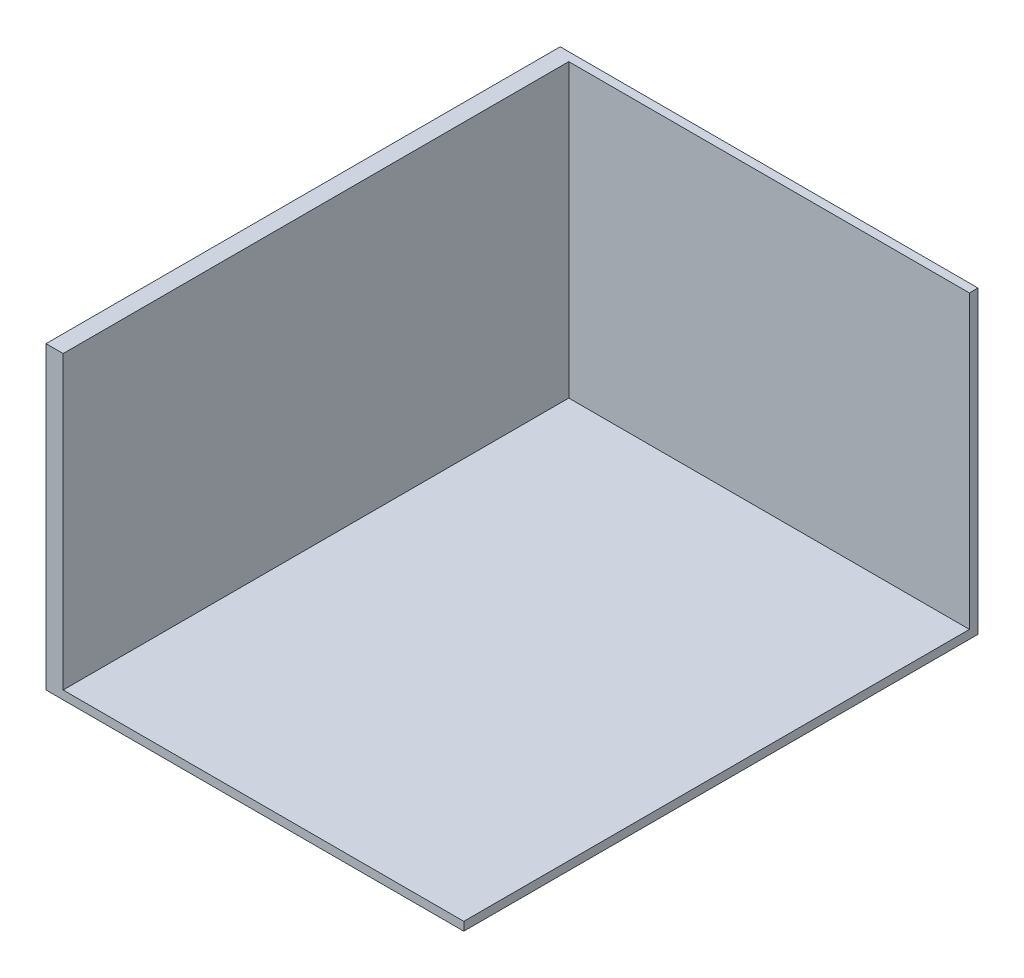
ISO-10303-21;
HEADER;
FILE_DESCRIPTION(('STEP AP214'),'2;1');
FILE_NAME('part.step','',(''),(''),'','','');
FILE_SCHEMA(('AUTOMOTIVE_DESIGN { 1 0 10303 214 1 1 1 1 }'));
ENDSEC;
DATA;
#1=APPLICATION_CONTEXT('core data for automotive mechanical design processes');
#2=APPLICATION_PROTOCOL_DEFINITION('international standard','automotive_design',2000,#1);
#3=PRODUCT_CONTEXT('',#1,'mechanical');
#4=PRODUCT('Part','Part','',(#3));
#5=PRODUCT_RELATED_PRODUCT_CATEGORY('part','',(#4));
#6=PRODUCT_DEFINITION_FORMATION('','',#4);
#7=PRODUCT_DEFINITION_CONTEXT('part definition',#1,'design');
#8=PRODUCT_DEFINITION('design','',#6,#7);
#9=PRODUCT_DEFINITION_SHAPE('','',#8);
#10=(LENGTH_UNIT() NAMED_UNIT(*) SI_UNIT(.MILLI.,.METRE.));
#11=(NAMED_UNIT(*) PLANE_ANGLE_UNIT() SI_UNIT($,.RADIAN.));
#12=(NAMED_UNIT(*) SI_UNIT($,.STERADIAN.) SOLID_ANGLE_UNIT());
#13=UNCERTAINTY_MEASURE_WITH_UNIT(LENGTH_MEASURE(1.E-05),#10,'distance_accuracy_value','');
#14=(GEOMETRIC_REPRESENTATION_CONTEXT(3) GLOBAL_UNCERTAINTY_ASSIGNED_CONTEXT((#13)) GLOBAL_UNIT_ASSIGNED_CONTEXT((#10,
#11,#12)) REPRESENTATION_CONTEXT('',''));
#15=CARTESIAN_POINT('',(0.,0.,0.));
#16=DIRECTION('',(0.,0.,1.));
#17=DIRECTION('',(1.,0.,0.));
#18=AXIS2_PLACEMENT_3D('',#15,#16,#17);
#19=CARTESIAN_POINT('',(0.,2.,0.));
#20=DIRECTION('',(0.,1.,0.));
#21=DIRECTION('',(0.,0.,1.));
#22=AXIS2_PLACEMENT_3D('',#19,#20,#21);
#23=PLANE('',#22);
#24=DIRECTION('',(1.,0.,0.));
#25=VECTOR('',#24,1.);
#26=CARTESIAN_POINT('',(-48.75,2.,-58.));
#27=LINE('',#26,#25);
#28=CARTESIAN_POINT('',(-44.75,2.,-58.));
#29=VERTEX_POINT('',#28);
#30=CARTESIAN_POINT('',(48.75,2.,-58.));
#31=VERTEX_POINT('',#30);
#32=EDGE_CURVE('E191',#29,#31,#27,.T.);
#33=ORIENTED_EDGE('',*,*,#32,.F.);
#34=DIRECTION('',(0.,0.,-1.));
#35=VECTOR('',#34,1.);
#36=CARTESIAN_POINT('',(-44.75,2.,-58.));
#37=LINE('',#36,#35);
#38=CARTESIAN_POINT('',(-44.75,2.,60.));
#39=VERTEX_POINT('',#38);
#40=EDGE_CURVE('E172',#39,#29,#37,.T.);
#41=ORIENTED_EDGE('',*,*,#40,.F.);
#42=DIRECTION('',(1.,0.,0.));
#43=VECTOR('',#42,1.);
#44=CARTESIAN_POINT('',(-48.75,2.,60.));
#45=LINE('',#44,#43);
#46=CARTESIAN_POINT('',(48.75,2.,60.));
#47=VERTEX_POINT('',#46);
#48=EDGE_CURVE('E218',#39,#47,#45,.T.);
#49=ORIENTED_EDGE('',*,*,#48,.T.);
#50=DIRECTION('',(0.,0.,-1.));
#51=VECTOR('',#50,1.);
#52=CARTESIAN_POINT('',(48.75,2.,-60.));
#53=LINE('',#52,#51);
#54=EDGE_CURVE('E214',#47,#31,#53,.T.);
#55=ORIENTED_EDGE('',*,*,#54,.T.);
#56=EDGE_LOOP('',(#33,#41,#49,#55));
#57=FACE_BOUND('',#56,.T.);
#58=ADVANCED_FACE('F42',(#57),#23,.T.);
#59=CARTESIAN_POINT('',(-48.75,70.,-58.));
#60=DIRECTION('',(0.,0.,-1.));
#61=DIRECTION('',(-1.,0.,0.));
#62=AXIS2_PLACEMENT_3D('',#59,#60,#61);
#63=PLANE('',#62);
#64=DIRECTION('',(0.,-1.,0.));
#65=VECTOR('',#64,1.);
#66=CARTESIAN_POINT('',(-44.75,70.,-58.));
#67=LINE('',#66,#65);
#68=CARTESIAN_POINT('',(-44.75,70.,-58.));
#69=VERTEX_POINT('',#68);
#70=EDGE_CURVE('E66',#69,#29,#67,.T.);
#71=ORIENTED_EDGE('',*,*,#70,.T.);
#72=ORIENTED_EDGE('',*,*,#32,.T.);
#73=DIRECTION('',(0.,-1.,0.));
#74=VECTOR('',#73,1.);
#75=CARTESIAN_POINT('',(48.75,70.,-58.));
#76=LINE('',#75,#74);
#77=CARTESIAN_POINT('',(48.75,70.,-58.));
#78=VERTEX_POINT('',#77);
#79=EDGE_CURVE('E207',#78,#31,#76,.T.);
#80=ORIENTED_EDGE('',*,*,#79,.F.);
#81=DIRECTION('',(1.,0.,0.));
#82=VECTOR('',#81,1.);
#83=CARTESIAN_POINT('',(-48.75,70.,-58.));
#84=LINE('',#83,#82);
#85=EDGE_CURVE('E196',#69,#78,#84,.T.);
#86=ORIENTED_EDGE('',*,*,#85,.F.);
#87=EDGE_LOOP('',(#71,#72,#80,#86));
#88=FACE_BOUND('',#87,.T.);
#89=ADVANCED_FACE('F270',(#88),#63,.F.);
#90=CARTESIAN_POINT('',(48.75,2.,-60.));
#91=DIRECTION('',(-1.,0.,0.));
#92=DIRECTION('',(0.,0.,1.));
#93=AXIS2_PLACEMENT_3D('',#90,#91,#92);
#94=PLANE('',#93);
#95=DIRECTION('',(0.,0.,-1.));
#96=VECTOR('',#95,1.);
#97=CARTESIAN_POINT('',(48.75,0.,-60.));
#98=LINE('',#97,#96);
#99=CARTESIAN_POINT('',(48.75,0.,60.));
#100=VERTEX_POINT('',#99);
#101=CARTESIAN_POINT('',(48.75,0.,-60.));
#102=VERTEX_POINT('',#101);
#103=EDGE_CURVE('E213',#100,#102,#98,.T.);
#104=ORIENTED_EDGE('',*,*,#103,.T.);
#105=DIRECTION('',(0.,-1.,0.));
#106=VECTOR('',#105,1.);
#107=CARTESIAN_POINT('',(48.75,2.,-60.));
#108=LINE('',#107,#106);
#109=CARTESIAN_POINT('',(48.75,70.,-60.));
#110=VERTEX_POINT('',#109);
#111=EDGE_CURVE('E11',#110,#102,#108,.T.);
#112=ORIENTED_EDGE('',*,*,#111,.F.);
#113=DIRECTION('',(0.,0.,-1.));
#114=VECTOR('',#113,1.);
#115=CARTESIAN_POINT('',(48.75,70.,-60.));
#116=LINE('',#115,#114);
#117=EDGE_CURVE('E199',#78,#110,#116,.T.);
#118=ORIENTED_EDGE('',*,*,#117,.F.);
#119=ORIENTED_EDGE('',*,*,#79,.T.);
#120=ORIENTED_EDGE('',*,*,#54,.F.);
#121=DIRECTION('',(0.,-1.,0.));
#122=VECTOR('',#121,1.);
#123=CARTESIAN_POINT('',(48.75,2.,60.));
#124=LINE('',#123,#122);
#125=EDGE_CURVE('E222',#47,#100,#124,.T.);
#126=ORIENTED_EDGE('',*,*,#125,.T.);
#127=EDGE_LOOP('',(#104,#112,#118,#119,#120,#126));
#128=FACE_BOUND('',#127,.T.);
#129=ADVANCED_FACE('F44',(#128),#94,.F.);
#130=CARTESIAN_POINT('',(-48.75,2.,-60.));
#131=DIRECTION('',(0.,0.,1.));
#132=DIRECTION('',(1.,0.,0.));
#133=AXIS2_PLACEMENT_3D('',#130,#131,#132);
#134=PLANE('',#133);
#135=DIRECTION('',(-1.,0.,0.));
#136=VECTOR('',#135,1.);
#137=CARTESIAN_POINT('',(-48.75,0.,-60.));
#138=LINE('',#137,#136);
#139=CARTESIAN_POINT('',(-48.75,0.,-60.));
#140=VERTEX_POINT('',#139);
#141=EDGE_CURVE('E226',#102,#140,#138,.T.);
#142=ORIENTED_EDGE('',*,*,#141,.T.);
#143=DIRECTION('',(0.,-1.,0.));
#144=VECTOR('',#143,1.);
#145=CARTESIAN_POINT('',(-48.75,2.,-60.));
#146=LINE('',#145,#144);
#147=CARTESIAN_POINT('',(-48.75,70.,-60.));
#148=VERTEX_POINT('',#147);
#149=EDGE_CURVE('E51',#148,#140,#146,.T.);
#150=ORIENTED_EDGE('',*,*,#149,.F.);
#151=DIRECTION('',(-1.,0.,0.));
#152=VECTOR('',#151,1.);
#153=CARTESIAN_POINT('',(-48.75,70.,-60.));
#154=LINE('',#153,#152);
#155=EDGE_CURVE('E203',#110,#148,#154,.T.);
#156=ORIENTED_EDGE('',*,*,#155,.F.);
#157=ORIENTED_EDGE('',*,*,#111,.T.);
#158=EDGE_LOOP('',(#142,#150,#156,#157));
#159=FACE_BOUND('',#158,.T.);
#160=ADVANCED_FACE('F271',(#159),#134,.F.);
#161=CARTESIAN_POINT('',(-48.75,2.,-60.));
#162=DIRECTION('',(1.,0.,0.));
#163=DIRECTION('',(0.,0.,-1.));
#164=AXIS2_PLACEMENT_3D('',#161,#162,#163);
#165=PLANE('',#164);
#166=DIRECTION('',(0.,0.,1.));
#167=VECTOR('',#166,1.);
#168=CARTESIAN_POINT('',(-48.75,1.,-15.25));
#169=LINE('',#168,#167);
#170=CARTESIAN_POINT('',(-48.75,1.,-15.25));
#171=VERTEX_POINT('',#170);
#172=CARTESIAN_POINT('',(-48.75,1.,15.25));
#173=VERTEX_POINT('',#172);
#174=EDGE_CURVE('E163',#171,#173,#169,.T.);
#175=ORIENTED_EDGE('',*,*,#174,.F.);
#176=DIRECTION('',(0.,-1.,0.));
#177=VECTOR('',#176,1.);
#178=CARTESIAN_POINT('',(-48.75,31.5,-15.25));
#179=LINE('',#178,#177);
#180=CARTESIAN_POINT('',(-48.75,31.5,-15.25));
#181=VERTEX_POINT('',#180);
#182=EDGE_CURVE('E58',#181,#171,#179,.T.);
#183=ORIENTED_EDGE('',*,*,#182,.F.);
#184=DIRECTION('',(0.,0.,-1.));
#185=VECTOR('',#184,1.);
#186=CARTESIAN_POINT('',(-48.75,31.5,-15.25));
#187=LINE('',#186,#185);
#188=CARTESIAN_POINT('',(-48.75,31.5,15.25));
#189=VERTEX_POINT('',#188);
#190=EDGE_CURVE('E150',#189,#181,#187,.T.);
#191=ORIENTED_EDGE('',*,*,#190,.F.);
#192=DIRECTION('',(0.,1.,0.));
#193=VECTOR('',#192,1.);
#194=CARTESIAN_POINT('',(-48.75,31.5,15.25));
#195=LINE('',#194,#193);
#196=EDGE_CURVE('E154',#173,#189,#195,.T.);
#197=ORIENTED_EDGE('',*,*,#196,.F.);
#198=EDGE_LOOP('',(#175,#183,#191,#197));
#199=FACE_BOUND('',#198,.T.);
#200=DIRECTION('',(0.,-1.,0.));
#201=VECTOR('',#200,1.);
#202=CARTESIAN_POINT('',(-48.75,2.,60.));
#203=LINE('',#202,#201);
#204=CARTESIAN_POINT('',(-48.75,70.,60.));
#205=VERTEX_POINT('',#204);
#206=CARTESIAN_POINT('',(-48.75,0.,60.));
#207=VERTEX_POINT('',#206);
#208=EDGE_CURVE('E237',#205,#207,#203,.T.);
#209=ORIENTED_EDGE('',*,*,#208,.F.);
#210=DIRECTION('',(0.,0.,1.));
#211=VECTOR('',#210,1.);
#212=CARTESIAN_POINT('',(-48.75,70.,-60.));
#213=LINE('',#212,#211);
#214=EDGE_CURVE('E192',#148,#205,#213,.T.);
#215=ORIENTED_EDGE('',*,*,#214,.F.);
#216=ORIENTED_EDGE('',*,*,#149,.T.);
#217=DIRECTION('',(0.,0.,1.));
#218=VECTOR('',#217,1.);
#219=CARTESIAN_POINT('',(-48.75,0.,-60.));
#220=LINE('',#219,#218);
#221=EDGE_CURVE('E229',#140,#207,#220,.T.);
#222=ORIENTED_EDGE('',*,*,#221,.T.);
#223=EDGE_LOOP('',(#209,#215,#216,#222));
#224=FACE_BOUND('',#223,.T.);
#225=ADVANCED_FACE('F245',(#199,#224),#165,.F.);
#226=CARTESIAN_POINT('',(-48.75,2.,60.));
#227=DIRECTION('',(0.,0.,-1.));
#228=DIRECTION('',(-1.,0.,0.));
#229=AXIS2_PLACEMENT_3D('',#226,#227,#228);
#230=PLANE('',#229);
#231=DIRECTION('',(1.,0.,0.));
#232=VECTOR('',#231,1.);
#233=CARTESIAN_POINT('',(-48.75,0.,60.));
#234=LINE('',#233,#232);
#235=EDGE_CURVE('E219',#207,#100,#234,.T.);
#236=ORIENTED_EDGE('',*,*,#235,.T.);
#237=ORIENTED_EDGE('',*,*,#125,.F.);
#238=ORIENTED_EDGE('',*,*,#48,.F.);
#239=DIRECTION('',(0.,-1.,0.));
#240=VECTOR('',#239,1.);
#241=CARTESIAN_POINT('',(-44.75,70.,60.));
#242=LINE('',#241,#240);
#243=CARTESIAN_POINT('',(-44.75,70.,60.));
#244=VERTEX_POINT('',#243);
#245=EDGE_CURVE('E188',#244,#39,#242,.T.);
#246=ORIENTED_EDGE('',*,*,#245,.F.);
#247=DIRECTION('',(1.,0.,0.));
#248=VECTOR('',#247,1.);
#249=CARTESIAN_POINT('',(-48.75,70.,60.));
#250=LINE('',#249,#248);
#251=EDGE_CURVE('E178',#205,#244,#250,.T.);
#252=ORIENTED_EDGE('',*,*,#251,.F.);
#253=ORIENTED_EDGE('',*,*,#208,.T.);
#254=EDGE_LOOP('',(#236,#237,#238,#246,#252,#253));
#255=FACE_BOUND('',#254,.T.);
#256=ADVANCED_FACE('F254',(#255),#230,.F.);
#257=CARTESIAN_POINT('',(0.,0.,0.));
#258=DIRECTION('',(0.,1.,0.));
#259=DIRECTION('',(0.,0.,1.));
#260=AXIS2_PLACEMENT_3D('',#257,#258,#259);
#261=PLANE('',#260);
#262=ORIENTED_EDGE('',*,*,#103,.F.);
#263=ORIENTED_EDGE('',*,*,#235,.F.);
#264=ORIENTED_EDGE('',*,*,#221,.F.);
#265=ORIENTED_EDGE('',*,*,#141,.F.);
#266=EDGE_LOOP('',(#262,#263,#264,#265));
#267=FACE_BOUND('',#266,.T.);
#268=ADVANCED_FACE('F251',(#267),#261,.F.);
#269=CARTESIAN_POINT('',(0.,70.,0.));
#270=DIRECTION('',(0.,1.,0.));
#271=DIRECTION('',(0.,0.,1.));
#272=AXIS2_PLACEMENT_3D('',#269,#270,#271);
#273=PLANE('',#272);
#274=ORIENTED_EDGE('',*,*,#214,.T.);
#275=ORIENTED_EDGE('',*,*,#251,.T.);
#276=DIRECTION('',(0.,0.,-1.));
#277=VECTOR('',#276,1.);
#278=CARTESIAN_POINT('',(-44.75,70.,-58.));
#279=LINE('',#278,#277);
#280=EDGE_CURVE('E181',#244,#69,#279,.T.);
#281=ORIENTED_EDGE('',*,*,#280,.T.);
#282=ORIENTED_EDGE('',*,*,#85,.T.);
#283=ORIENTED_EDGE('',*,*,#117,.T.);
#284=ORIENTED_EDGE('',*,*,#155,.T.);
#285=EDGE_LOOP('',(#274,#275,#281,#282,#283,#284));
#286=FACE_BOUND('',#285,.T.);
#287=ADVANCED_FACE('F268',(#286),#273,.T.);
#288=CARTESIAN_POINT('',(-44.75,70.,-58.));
#289=DIRECTION('',(-1.,0.,0.));
#290=DIRECTION('',(0.,0.,1.));
#291=AXIS2_PLACEMENT_3D('',#288,#289,#290);
#292=PLANE('',#291);
#293=ORIENTED_EDGE('',*,*,#40,.T.);
#294=ORIENTED_EDGE('',*,*,#70,.F.);
#295=ORIENTED_EDGE('',*,*,#280,.F.);
#296=ORIENTED_EDGE('',*,*,#245,.T.);
#297=EDGE_LOOP('',(#293,#294,#295,#296));
#298=FACE_BOUND('',#297,.T.);
#299=ADVANCED_FACE('F265',(#298),#292,.F.);
#300=CARTESIAN_POINT('',(-46.75,31.5,-15.25));
#301=DIRECTION('',(0.,0.,-1.));
#302=DIRECTION('',(-1.,0.,0.));
#303=AXIS2_PLACEMENT_3D('',#300,#301,#302);
#304=PLANE('',#303);
#305=ORIENTED_EDGE('',*,*,#182,.T.);
#306=DIRECTION('',(-1.,0.,0.));
#307=VECTOR('',#306,1.);
#308=CARTESIAN_POINT('',(-46.75,1.,-15.25));
#309=LINE('',#308,#307);
#310=CARTESIAN_POINT('',(-46.75,1.,-15.25));
#311=VERTEX_POINT('',#310);
#312=EDGE_CURVE('E125',#311,#171,#309,.T.);
#313=ORIENTED_EDGE('',*,*,#312,.F.);
#314=DIRECTION('',(0.,-1.,0.));
#315=VECTOR('',#314,1.);
#316=CARTESIAN_POINT('',(-46.75,31.5,-15.25));
#317=LINE('',#316,#315);
#318=CARTESIAN_POINT('',(-46.75,31.5,-15.25));
#319=VERTEX_POINT('',#318);
#320=EDGE_CURVE('E129',#319,#311,#317,.T.);
#321=ORIENTED_EDGE('',*,*,#320,.F.);
#322=DIRECTION('',(-1.,0.,0.));
#323=VECTOR('',#322,1.);
#324=CARTESIAN_POINT('',(-46.75,31.5,-15.25));
#325=LINE('',#324,#323);
#326=EDGE_CURVE('E169',#319,#181,#325,.T.);
#327=ORIENTED_EDGE('',*,*,#326,.T.);
#328=EDGE_LOOP('',(#305,#313,#321,#327));
#329=FACE_BOUND('',#328,.T.);
#330=ADVANCED_FACE('F127',(#329),#304,.F.);
#331=CARTESIAN_POINT('',(-46.75,31.5,-15.25));
#332=DIRECTION('',(0.,1.,0.));
#333=DIRECTION('',(0.,0.,1.));
#334=AXIS2_PLACEMENT_3D('',#331,#332,#333);
#335=PLANE('',#334);
#336=ORIENTED_EDGE('',*,*,#190,.T.);
#337=ORIENTED_EDGE('',*,*,#326,.F.);
#338=DIRECTION('',(0.,0.,-1.));
#339=VECTOR('',#338,1.);
#340=CARTESIAN_POINT('',(-46.75,31.5,-15.25));
#341=LINE('',#340,#339);
#342=CARTESIAN_POINT('',(-46.75,31.5,15.25));
#343=VERTEX_POINT('',#342);
#344=EDGE_CURVE('E136',#343,#319,#341,.T.);
#345=ORIENTED_EDGE('',*,*,#344,.F.);
#346=DIRECTION('',(-1.,0.,0.));
#347=VECTOR('',#346,1.);
#348=CARTESIAN_POINT('',(-46.75,31.5,15.25));
#349=LINE('',#348,#347);
#350=EDGE_CURVE('E173',#343,#189,#349,.T.);
#351=ORIENTED_EDGE('',*,*,#350,.T.);
#352=EDGE_LOOP('',(#336,#337,#345,#351));
#353=FACE_BOUND('',#352,.T.);
#354=ADVANCED_FACE('F318',(#353),#335,.F.);
#355=CARTESIAN_POINT('',(-46.75,31.5,15.25));
#356=DIRECTION('',(0.,0.,1.));
#357=DIRECTION('',(1.,0.,0.));
#358=AXIS2_PLACEMENT_3D('',#355,#356,#357);
#359=PLANE('',#358);
#360=ORIENTED_EDGE('',*,*,#196,.T.);
#361=ORIENTED_EDGE('',*,*,#350,.F.);
#362=DIRECTION('',(0.,1.,0.));
#363=VECTOR('',#362,1.);
#364=CARTESIAN_POINT('',(-46.75,31.5,15.25));
#365=LINE('',#364,#363);
#366=CARTESIAN_POINT('',(-46.75,1.,15.25));
#367=VERTEX_POINT('',#366);
#368=EDGE_CURVE('E145',#367,#343,#365,.T.);
#369=ORIENTED_EDGE('',*,*,#368,.F.);
#370=DIRECTION('',(-1.,0.,0.));
#371=VECTOR('',#370,1.);
#372=CARTESIAN_POINT('',(-46.75,1.,15.25));
#373=LINE('',#372,#371);
#374=EDGE_CURVE('E135',#367,#173,#373,.T.);
#375=ORIENTED_EDGE('',*,*,#374,.T.);
#376=EDGE_LOOP('',(#360,#361,#369,#375));
#377=FACE_BOUND('',#376,.T.);
#378=ADVANCED_FACE('F325',(#377),#359,.F.);
#379=CARTESIAN_POINT('',(-46.75,1.,-15.25));
#380=DIRECTION('',(0.,-1.,0.));
#381=DIRECTION('',(0.,0.,-1.));
#382=AXIS2_PLACEMENT_3D('',#379,#380,#381);
#383=PLANE('',#382);
#384=ORIENTED_EDGE('',*,*,#174,.T.);
#385=ORIENTED_EDGE('',*,*,#374,.F.);
#386=DIRECTION('',(0.,0.,1.));
#387=VECTOR('',#386,1.);
#388=CARTESIAN_POINT('',(-46.75,1.,-15.25));
#389=LINE('',#388,#387);
#390=EDGE_CURVE('E139',#311,#367,#389,.T.);
#391=ORIENTED_EDGE('',*,*,#390,.F.);
#392=ORIENTED_EDGE('',*,*,#312,.T.);
#393=EDGE_LOOP('',(#384,#385,#391,#392));
#394=FACE_BOUND('',#393,.T.);
#395=ADVANCED_FACE('F140',(#394),#383,.F.);
#396=CARTESIAN_POINT('',(-46.75,0.,0.));
#397=DIRECTION('',(-1.,0.,0.));
#398=DIRECTION('',(0.,0.,1.));
#399=AXIS2_PLACEMENT_3D('',#396,#397,#398);
#400=PLANE('',#399);
#401=ORIENTED_EDGE('',*,*,#320,.T.);
#402=ORIENTED_EDGE('',*,*,#390,.T.);
#403=ORIENTED_EDGE('',*,*,#368,.T.);
#404=ORIENTED_EDGE('',*,*,#344,.T.);
#405=EDGE_LOOP('',(#401,#402,#403,#404));
#406=FACE_BOUND('',#405,.T.);
#407=ADVANCED_FACE('F147',(#406),#400,.T.);
#408=CLOSED_SHELL('',(#58,#89,#129,#160,#225,#256,#268,#287,#299,#330,#354,#378,#395,#407));
#409=MANIFOLD_SOLID_BREP('B2',#408);
#410=ADVANCED_BREP_SHAPE_REPRESENTATION('',(#18,#409),#14);
#411=SHAPE_DEFINITION_REPRESENTATION(#9,#410);
ENDSEC;
END-ISO-10303-21;
